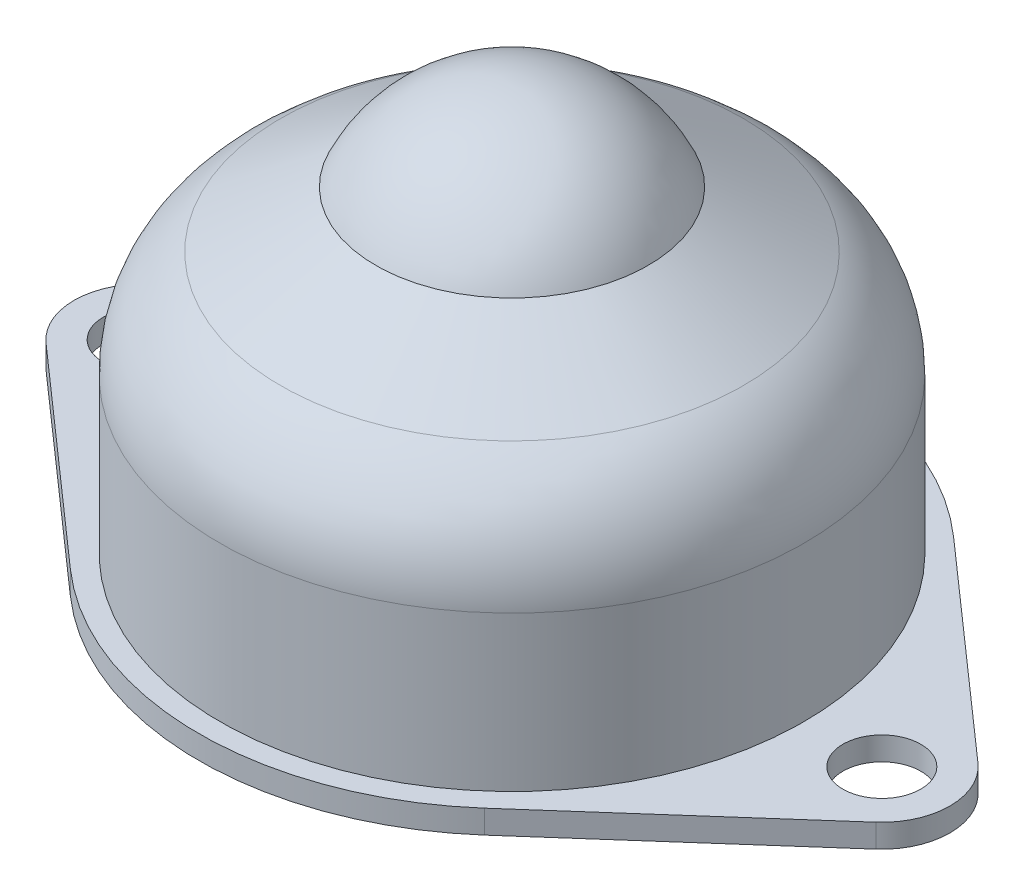
ISO-10303-21;
HEADER;
FILE_DESCRIPTION(('STEP AP214'),'2;1');
FILE_NAME('part.step','',(''),(''),'','','');
FILE_SCHEMA(('AUTOMOTIVE_DESIGN { 1 0 10303 214 1 1 1 1 }'));
ENDSEC;
DATA;
#1=APPLICATION_CONTEXT('core data for automotive mechanical design processes');
#2=APPLICATION_PROTOCOL_DEFINITION('international standard','automotive_design',2000,#1);
#3=PRODUCT_CONTEXT('',#1,'mechanical');
#4=PRODUCT('Part','Part','',(#3));
#5=PRODUCT_RELATED_PRODUCT_CATEGORY('part','',(#4));
#6=PRODUCT_DEFINITION_FORMATION('','',#4);
#7=PRODUCT_DEFINITION_CONTEXT('part definition',#1,'design');
#8=PRODUCT_DEFINITION('design','',#6,#7);
#9=PRODUCT_DEFINITION_SHAPE('','',#8);
#10=(LENGTH_UNIT() NAMED_UNIT(*) SI_UNIT(.MILLI.,.METRE.));
#11=(NAMED_UNIT(*) PLANE_ANGLE_UNIT() SI_UNIT($,.RADIAN.));
#12=(NAMED_UNIT(*) SI_UNIT($,.STERADIAN.) SOLID_ANGLE_UNIT());
#13=UNCERTAINTY_MEASURE_WITH_UNIT(LENGTH_MEASURE(1.E-05),#10,'distance_accuracy_value','');
#14=(GEOMETRIC_REPRESENTATION_CONTEXT(3) GLOBAL_UNCERTAINTY_ASSIGNED_CONTEXT((#13)) GLOBAL_UNIT_ASSIGNED_CONTEXT((#10,
#11,#12)) REPRESENTATION_CONTEXT('',''));
#15=CARTESIAN_POINT('',(0.,0.,0.));
#16=DIRECTION('',(0.,0.,1.));
#17=DIRECTION('',(1.,0.,0.));
#18=AXIS2_PLACEMENT_3D('',#15,#16,#17);
#19=CARTESIAN_POINT('',(0.,0.,0.));
#20=DIRECTION('',(0.,1.,0.));
#21=DIRECTION('',(0.,0.,1.));
#22=AXIS2_PLACEMENT_3D('',#19,#20,#21);
#23=PLANE('',#22);
#24=CARTESIAN_POINT('',(0.,0.,0.));
#25=DIRECTION('',(0.,1.,0.));
#26=DIRECTION('',(0.,0.,1.));
#27=AXIS2_PLACEMENT_3D('',#24,#25,#26);
#28=CIRCLE('',#27,16.075);
#29=CARTESIAN_POINT('',(-10.6391118421053,0.,12.0505155164074));
#30=VERTEX_POINT('',#29);
#31=CARTESIAN_POINT('',(10.6391118421053,0.,12.0505155164074));
#32=VERTEX_POINT('',#31);
#33=EDGE_CURVE('E204',#30,#32,#28,.T.);
#34=ORIENTED_EDGE('',*,*,#33,.F.);
#35=DIRECTION('',(0.74964326696158,0.,0.661842105263158));
#36=VECTOR('',#35,1.);
#37=CARTESIAN_POINT('',(-10.6391118421053,0.,12.0505155164074));
#38=LINE('',#37,#36);
#39=CARTESIAN_POINT('',(-21.3164473684211,0.,2.62375143436553));
#40=VERTEX_POINT('',#39);
#41=EDGE_CURVE('E201',#40,#30,#38,.T.);
#42=ORIENTED_EDGE('',*,*,#41,.F.);
#43=CARTESIAN_POINT('',(-19.,0.,0.));
#44=DIRECTION('',(0.,1.,0.));
#45=DIRECTION('',(0.,0.,1.));
#46=AXIS2_PLACEMENT_3D('',#43,#44,#45);
#47=CIRCLE('',#46,3.5);
#48=CARTESIAN_POINT('',(-21.3164473684211,0.,-2.62375143436553));
#49=VERTEX_POINT('',#48);
#50=EDGE_CURVE('E157',#49,#40,#47,.T.);
#51=ORIENTED_EDGE('',*,*,#50,.F.);
#52=DIRECTION('',(0.74964326696158,0.,-0.661842105263158));
#53=VECTOR('',#52,1.);
#54=CARTESIAN_POINT('',(-10.6391118421053,0.,-12.0505155164074));
#55=LINE('',#54,#53);
#56=CARTESIAN_POINT('',(-10.6391118421053,0.,-12.0505155164074));
#57=VERTEX_POINT('',#56);
#58=EDGE_CURVE('E195',#49,#57,#55,.T.);
#59=ORIENTED_EDGE('',*,*,#58,.T.);
#60=CARTESIAN_POINT('',(0.,0.,0.));
#61=DIRECTION('',(0.,1.,0.));
#62=DIRECTION('',(0.,0.,1.));
#63=AXIS2_PLACEMENT_3D('',#60,#61,#62);
#64=CIRCLE('',#63,16.075);
#65=CARTESIAN_POINT('',(10.6391118421053,0.,-12.0505155164074));
#66=VERTEX_POINT('',#65);
#67=EDGE_CURVE('E191',#66,#57,#64,.T.);
#68=ORIENTED_EDGE('',*,*,#67,.F.);
#69=DIRECTION('',(0.74964326696158,0.,0.661842105263158));
#70=VECTOR('',#69,1.);
#71=CARTESIAN_POINT('',(10.6391118421053,0.,-12.0505155164074));
#72=LINE('',#71,#70);
#73=CARTESIAN_POINT('',(21.3164473684211,0.,-2.62375143436553));
#74=VERTEX_POINT('',#73);
#75=EDGE_CURVE('E187',#66,#74,#72,.T.);
#76=ORIENTED_EDGE('',*,*,#75,.T.);
#77=CARTESIAN_POINT('',(19.,0.,0.));
#78=DIRECTION('',(0.,1.,0.));
#79=DIRECTION('',(0.,0.,1.));
#80=AXIS2_PLACEMENT_3D('',#77,#78,#79);
#81=CIRCLE('',#80,3.5);
#82=CARTESIAN_POINT('',(21.3164473684211,0.,2.62375143436552));
#83=VERTEX_POINT('',#82);
#84=EDGE_CURVE('E182',#83,#74,#81,.T.);
#85=ORIENTED_EDGE('',*,*,#84,.F.);
#86=DIRECTION('',(0.74964326696158,0.,-0.661842105263158));
#87=VECTOR('',#86,1.);
#88=CARTESIAN_POINT('',(10.6391118421053,0.,12.0505155164074));
#89=LINE('',#88,#87);
#90=EDGE_CURVE('E179',#32,#83,#89,.T.);
#91=ORIENTED_EDGE('',*,*,#90,.F.);
#92=EDGE_LOOP('',(#34,#42,#51,#59,#68,#76,#85,#91));
#93=FACE_BOUND('',#92,.T.);
#94=CARTESIAN_POINT('',(-19.,0.,0.));
#95=DIRECTION('',(0.,1.,0.));
#96=DIRECTION('',(0.,0.,1.));
#97=AXIS2_PLACEMENT_3D('',#94,#95,#96);
#98=CIRCLE('',#97,2.);
#99=CARTESIAN_POINT('',(-19.,0.,2.));
#100=VERTEX_POINT('',#99);
#101=EDGE_CURVE('E207',#100,#100,#98,.T.);
#102=ORIENTED_EDGE('',*,*,#101,.T.);
#103=EDGE_LOOP('',(#102));
#104=FACE_BOUND('',#103,.T.);
#105=CARTESIAN_POINT('',(19.,0.,0.));
#106=DIRECTION('',(0.,1.,0.));
#107=DIRECTION('',(0.,0.,1.));
#108=AXIS2_PLACEMENT_3D('',#105,#106,#107);
#109=CIRCLE('',#108,2.);
#110=CARTESIAN_POINT('',(19.,0.,1.99999999999999));
#111=VERTEX_POINT('',#110);
#112=EDGE_CURVE('E211',#111,#111,#109,.T.);
#113=ORIENTED_EDGE('',*,*,#112,.T.);
#114=EDGE_LOOP('',(#113));
#115=FACE_BOUND('',#114,.T.);
#116=ADVANCED_FACE('F68',(#93,#104,#115),#23,.F.);
#117=CARTESIAN_POINT('',(0.,1.2,0.));
#118=DIRECTION('',(0.,-1.,0.));
#119=DIRECTION('',(0.,0.,-1.));
#120=AXIS2_PLACEMENT_3D('',#117,#118,#119);
#121=CYLINDRICAL_SURFACE('',#120,16.075);
#122=ORIENTED_EDGE('',*,*,#33,.T.);
#123=DIRECTION('',(0.,-1.,0.));
#124=VECTOR('',#123,1.);
#125=CARTESIAN_POINT('',(10.6391118421053,1.2,12.0505155164074));
#126=LINE('',#125,#124);
#127=CARTESIAN_POINT('',(10.6391118421053,1.2,12.0505155164074));
#128=VERTEX_POINT('',#127);
#129=EDGE_CURVE('E86',#128,#32,#126,.T.);
#130=ORIENTED_EDGE('',*,*,#129,.F.);
#131=CARTESIAN_POINT('',(0.,1.2,0.));
#132=DIRECTION('',(0.,1.,0.));
#133=DIRECTION('',(0.,0.,1.));
#134=AXIS2_PLACEMENT_3D('',#131,#132,#133);
#135=CIRCLE('',#134,16.075);
#136=CARTESIAN_POINT('',(-10.6391118421053,1.2,12.0505155164074));
#137=VERTEX_POINT('',#136);
#138=EDGE_CURVE('E165',#137,#128,#135,.T.);
#139=ORIENTED_EDGE('',*,*,#138,.F.);
#140=DIRECTION('',(0.,-1.,0.));
#141=VECTOR('',#140,1.);
#142=CARTESIAN_POINT('',(-10.6391118421053,1.2,12.0505155164074));
#143=LINE('',#142,#141);
#144=EDGE_CURVE('E112',#137,#30,#143,.T.);
#145=ORIENTED_EDGE('',*,*,#144,.T.);
#146=EDGE_LOOP('',(#122,#130,#139,#145));
#147=FACE_BOUND('',#146,.T.);
#148=ADVANCED_FACE('F256',(#147),#121,.T.);
#149=CARTESIAN_POINT('',(0.,1.2,0.));
#150=DIRECTION('',(0.,-1.,0.));
#151=DIRECTION('',(0.,0.,-1.));
#152=AXIS2_PLACEMENT_3D('',#149,#150,#151);
#153=CYLINDRICAL_SURFACE('',#152,16.075);
#154=ORIENTED_EDGE('',*,*,#67,.T.);
#155=DIRECTION('',(0.,-1.,0.));
#156=VECTOR('',#155,1.);
#157=CARTESIAN_POINT('',(-10.6391118421053,1.2,-12.0505155164074));
#158=LINE('',#157,#156);
#159=CARTESIAN_POINT('',(-10.6391118421053,1.2,-12.0505155164074));
#160=VERTEX_POINT('',#159);
#161=EDGE_CURVE('E222',#160,#57,#158,.T.);
#162=ORIENTED_EDGE('',*,*,#161,.F.);
#163=CARTESIAN_POINT('',(0.,1.2,0.));
#164=DIRECTION('',(0.,1.,0.));
#165=DIRECTION('',(0.,0.,1.));
#166=AXIS2_PLACEMENT_3D('',#163,#164,#165);
#167=CIRCLE('',#166,16.075);
#168=CARTESIAN_POINT('',(10.6391118421053,1.2,-12.0505155164074));
#169=VERTEX_POINT('',#168);
#170=EDGE_CURVE('E245',#169,#160,#167,.T.);
#171=ORIENTED_EDGE('',*,*,#170,.F.);
#172=DIRECTION('',(0.,-1.,0.));
#173=VECTOR('',#172,1.);
#174=CARTESIAN_POINT('',(10.6391118421053,1.2,-12.0505155164074));
#175=LINE('',#174,#173);
#176=EDGE_CURVE('E225',#169,#66,#175,.T.);
#177=ORIENTED_EDGE('',*,*,#176,.T.);
#178=EDGE_LOOP('',(#154,#162,#171,#177));
#179=FACE_BOUND('',#178,.T.);
#180=ADVANCED_FACE('F243',(#179),#153,.T.);
#181=CARTESIAN_POINT('',(0.,1.2,0.));
#182=DIRECTION('',(0.,1.,0.));
#183=DIRECTION('',(0.,0.,1.));
#184=AXIS2_PLACEMENT_3D('',#181,#182,#183);
#185=PLANE('',#184);
#186=CARTESIAN_POINT('',(0.,1.2,0.));
#187=DIRECTION('',(0.,-1.,0.));
#188=DIRECTION('',(0.,0.,-1.));
#189=AXIS2_PLACEMENT_3D('',#186,#187,#188);
#190=CIRCLE('',#189,15.);
#191=CARTESIAN_POINT('',(0.,1.2,-15.));
#192=VERTEX_POINT('',#191);
#193=EDGE_CURVE('E183',#192,#192,#190,.T.);
#194=ORIENTED_EDGE('',*,*,#193,.T.);
#195=EDGE_LOOP('',(#194));
#196=FACE_BOUND('',#195,.T.);
#197=ORIENTED_EDGE('',*,*,#170,.T.);
#198=DIRECTION('',(0.74964326696158,0.,-0.661842105263158));
#199=VECTOR('',#198,1.);
#200=CARTESIAN_POINT('',(-10.6391118421053,1.2,-12.0505155164074));
#201=LINE('',#200,#199);
#202=CARTESIAN_POINT('',(-21.3164473684211,1.2,-2.62375143436553));
#203=VERTEX_POINT('',#202);
#204=EDGE_CURVE('E149',#203,#160,#201,.T.);
#205=ORIENTED_EDGE('',*,*,#204,.F.);
#206=CARTESIAN_POINT('',(-19.,1.2,0.));
#207=DIRECTION('',(0.,1.,0.));
#208=DIRECTION('',(0.,0.,1.));
#209=AXIS2_PLACEMENT_3D('',#206,#207,#208);
#210=CIRCLE('',#209,3.5);
#211=CARTESIAN_POINT('',(-21.3164473684211,1.2,2.62375143436553));
#212=VERTEX_POINT('',#211);
#213=EDGE_CURVE('E141',#203,#212,#210,.T.);
#214=ORIENTED_EDGE('',*,*,#213,.T.);
#215=DIRECTION('',(0.74964326696158,0.,0.661842105263158));
#216=VECTOR('',#215,1.);
#217=CARTESIAN_POINT('',(-10.6391118421053,1.2,12.0505155164074));
#218=LINE('',#217,#216);
#219=EDGE_CURVE('E147',#212,#137,#218,.T.);
#220=ORIENTED_EDGE('',*,*,#219,.T.);
#221=ORIENTED_EDGE('',*,*,#138,.T.);
#222=DIRECTION('',(0.74964326696158,0.,-0.661842105263158));
#223=VECTOR('',#222,1.);
#224=CARTESIAN_POINT('',(10.6391118421053,1.2,12.0505155164074));
#225=LINE('',#224,#223);
#226=CARTESIAN_POINT('',(21.3164473684211,1.2,2.62375143436552));
#227=VERTEX_POINT('',#226);
#228=EDGE_CURVE('E215',#128,#227,#225,.T.);
#229=ORIENTED_EDGE('',*,*,#228,.T.);
#230=CARTESIAN_POINT('',(19.,1.2,0.));
#231=DIRECTION('',(0.,1.,0.));
#232=DIRECTION('',(0.,0.,1.));
#233=AXIS2_PLACEMENT_3D('',#230,#231,#232);
#234=CIRCLE('',#233,3.5);
#235=CARTESIAN_POINT('',(21.3164473684211,1.2,-2.62375143436553));
#236=VERTEX_POINT('',#235);
#237=EDGE_CURVE('E124',#227,#236,#234,.T.);
#238=ORIENTED_EDGE('',*,*,#237,.T.);
#239=DIRECTION('',(0.74964326696158,0.,0.661842105263158));
#240=VECTOR('',#239,1.);
#241=CARTESIAN_POINT('',(10.6391118421053,1.2,-12.0505155164074));
#242=LINE('',#241,#240);
#243=EDGE_CURVE('E233',#169,#236,#242,.T.);
#244=ORIENTED_EDGE('',*,*,#243,.F.);
#245=EDGE_LOOP('',(#197,#205,#214,#220,#221,#229,#238,#244));
#246=FACE_BOUND('',#245,.T.);
#247=CARTESIAN_POINT('',(-19.,1.2,0.));
#248=DIRECTION('',(0.,1.,0.));
#249=DIRECTION('',(0.,0.,1.));
#250=AXIS2_PLACEMENT_3D('',#247,#248,#249);
#251=CIRCLE('',#250,2.);
#252=CARTESIAN_POINT('',(-19.,1.2,2.));
#253=VERTEX_POINT('',#252);
#254=EDGE_CURVE('E168',#253,#253,#251,.T.);
#255=ORIENTED_EDGE('',*,*,#254,.F.);
#256=EDGE_LOOP('',(#255));
#257=FACE_BOUND('',#256,.T.);
#258=CARTESIAN_POINT('',(19.,1.2,0.));
#259=DIRECTION('',(0.,1.,0.));
#260=DIRECTION('',(0.,0.,1.));
#261=AXIS2_PLACEMENT_3D('',#258,#259,#260);
#262=CIRCLE('',#261,2.);
#263=CARTESIAN_POINT('',(19.,1.2,1.99999999999999));
#264=VERTEX_POINT('',#263);
#265=EDGE_CURVE('E175',#264,#264,#262,.T.);
#266=ORIENTED_EDGE('',*,*,#265,.F.);
#267=EDGE_LOOP('',(#266));
#268=FACE_BOUND('',#267,.T.);
#269=ADVANCED_FACE('F144',(#196,#246,#257,#268),#185,.T.);
#270=CARTESIAN_POINT('',(10.6391118421053,1.2,12.0505155164074));
#271=DIRECTION('',(-0.661842105263158,0.,-0.74964326696158));
#272=DIRECTION('',(-0.74964326696158,0.,0.661842105263158));
#273=AXIS2_PLACEMENT_3D('',#270,#271,#272);
#274=PLANE('',#273);
#275=ORIENTED_EDGE('',*,*,#90,.T.);
#276=DIRECTION('',(0.,-1.,0.));
#277=VECTOR('',#276,1.);
#278=CARTESIAN_POINT('',(21.3164473684211,1.2,2.62375143436552));
#279=LINE('',#278,#277);
#280=EDGE_CURVE('E12',#227,#83,#279,.T.);
#281=ORIENTED_EDGE('',*,*,#280,.F.);
#282=ORIENTED_EDGE('',*,*,#228,.F.);
#283=ORIENTED_EDGE('',*,*,#129,.T.);
#284=EDGE_LOOP('',(#275,#281,#282,#283));
#285=FACE_BOUND('',#284,.T.);
#286=ADVANCED_FACE('F70',(#285),#274,.F.);
#287=CARTESIAN_POINT('',(19.,1.2,0.));
#288=DIRECTION('',(0.,-1.,0.));
#289=DIRECTION('',(0.,0.,-1.));
#290=AXIS2_PLACEMENT_3D('',#287,#288,#289);
#291=CYLINDRICAL_SURFACE('',#290,3.5);
#292=ORIENTED_EDGE('',*,*,#84,.T.);
#293=DIRECTION('',(0.,-1.,0.));
#294=VECTOR('',#293,1.);
#295=CARTESIAN_POINT('',(21.3164473684211,1.2,-2.62375143436553));
#296=LINE('',#295,#294);
#297=EDGE_CURVE('E78',#236,#74,#296,.T.);
#298=ORIENTED_EDGE('',*,*,#297,.F.);
#299=ORIENTED_EDGE('',*,*,#237,.F.);
#300=ORIENTED_EDGE('',*,*,#280,.T.);
#301=EDGE_LOOP('',(#292,#298,#299,#300));
#302=FACE_BOUND('',#301,.T.);
#303=ADVANCED_FACE('F234',(#302),#291,.T.);
#304=CARTESIAN_POINT('',(10.6391118421053,1.2,-12.0505155164074));
#305=DIRECTION('',(0.661842105263158,0.,-0.74964326696158));
#306=DIRECTION('',(-0.74964326696158,0.,-0.661842105263158));
#307=AXIS2_PLACEMENT_3D('',#304,#305,#306);
#308=PLANE('',#307);
#309=ORIENTED_EDGE('',*,*,#75,.F.);
#310=ORIENTED_EDGE('',*,*,#176,.F.);
#311=ORIENTED_EDGE('',*,*,#243,.T.);
#312=ORIENTED_EDGE('',*,*,#297,.T.);
#313=EDGE_LOOP('',(#309,#310,#311,#312));
#314=FACE_BOUND('',#313,.T.);
#315=ADVANCED_FACE('F231',(#314),#308,.T.);
#316=CARTESIAN_POINT('',(19.,1.2,0.));
#317=DIRECTION('',(0.,-1.,0.));
#318=DIRECTION('',(0.,0.,-1.));
#319=AXIS2_PLACEMENT_3D('',#316,#317,#318);
#320=CYLINDRICAL_SURFACE('',#319,2.);
#321=ORIENTED_EDGE('',*,*,#265,.T.);
#322=EDGE_LOOP('',(#321));
#323=FACE_BOUND('',#322,.T.);
#324=ORIENTED_EDGE('',*,*,#112,.F.);
#325=EDGE_LOOP('',(#324));
#326=FACE_BOUND('',#325,.T.);
#327=ADVANCED_FACE('F264',(#323,#326),#320,.F.);
#328=CARTESIAN_POINT('',(-10.6391118421053,1.2,-12.0505155164074));
#329=DIRECTION('',(-0.661842105263158,0.,-0.74964326696158));
#330=DIRECTION('',(-0.74964326696158,0.,0.661842105263158));
#331=AXIS2_PLACEMENT_3D('',#328,#329,#330);
#332=PLANE('',#331);
#333=ORIENTED_EDGE('',*,*,#58,.F.);
#334=DIRECTION('',(0.,-1.,0.));
#335=VECTOR('',#334,1.);
#336=CARTESIAN_POINT('',(-21.3164473684211,1.2,-2.62375143436553));
#337=LINE('',#336,#335);
#338=EDGE_CURVE('E161',#203,#49,#337,.T.);
#339=ORIENTED_EDGE('',*,*,#338,.F.);
#340=ORIENTED_EDGE('',*,*,#204,.T.);
#341=ORIENTED_EDGE('',*,*,#161,.T.);
#342=EDGE_LOOP('',(#333,#339,#340,#341));
#343=FACE_BOUND('',#342,.T.);
#344=ADVANCED_FACE('F255',(#343),#332,.T.);
#345=CARTESIAN_POINT('',(-19.,1.2,0.));
#346=DIRECTION('',(0.,-1.,0.));
#347=DIRECTION('',(0.,0.,-1.));
#348=AXIS2_PLACEMENT_3D('',#345,#346,#347);
#349=CYLINDRICAL_SURFACE('',#348,3.5);
#350=ORIENTED_EDGE('',*,*,#50,.T.);
#351=DIRECTION('',(0.,-1.,0.));
#352=VECTOR('',#351,1.);
#353=CARTESIAN_POINT('',(-21.3164473684211,1.2,2.62375143436553));
#354=LINE('',#353,#352);
#355=EDGE_CURVE('E154',#212,#40,#354,.T.);
#356=ORIENTED_EDGE('',*,*,#355,.F.);
#357=ORIENTED_EDGE('',*,*,#213,.F.);
#358=ORIENTED_EDGE('',*,*,#338,.T.);
#359=EDGE_LOOP('',(#350,#356,#357,#358));
#360=FACE_BOUND('',#359,.T.);
#361=ADVANCED_FACE('F155',(#360),#349,.T.);
#362=CARTESIAN_POINT('',(-10.6391118421053,1.2,12.0505155164074));
#363=DIRECTION('',(0.661842105263158,0.,-0.74964326696158));
#364=DIRECTION('',(-0.74964326696158,0.,-0.661842105263158));
#365=AXIS2_PLACEMENT_3D('',#362,#363,#364);
#366=PLANE('',#365);
#367=ORIENTED_EDGE('',*,*,#41,.T.);
#368=ORIENTED_EDGE('',*,*,#144,.F.);
#369=ORIENTED_EDGE('',*,*,#219,.F.);
#370=ORIENTED_EDGE('',*,*,#355,.T.);
#371=EDGE_LOOP('',(#367,#368,#369,#370));
#372=FACE_BOUND('',#371,.T.);
#373=ADVANCED_FACE('F163',(#372),#366,.F.);
#374=CARTESIAN_POINT('',(-19.,1.2,0.));
#375=DIRECTION('',(0.,-1.,0.));
#376=DIRECTION('',(0.,0.,-1.));
#377=AXIS2_PLACEMENT_3D('',#374,#375,#376);
#378=CYLINDRICAL_SURFACE('',#377,2.);
#379=ORIENTED_EDGE('',*,*,#254,.T.);
#380=EDGE_LOOP('',(#379));
#381=FACE_BOUND('',#380,.T.);
#382=ORIENTED_EDGE('',*,*,#101,.F.);
#383=EDGE_LOOP('',(#382));
#384=FACE_BOUND('',#383,.T.);
#385=ADVANCED_FACE('F268',(#381,#384),#378,.F.);
#386=CARTESIAN_POINT('',(0.,1.2,0.));
#387=DIRECTION('',(0.,-1.,0.));
#388=DIRECTION('',(0.,0.,-1.));
#389=AXIS2_PLACEMENT_3D('',#386,#387,#388);
#390=CYLINDRICAL_SURFACE('',#389,15.);
#391=ORIENTED_EDGE('',*,*,#193,.F.);
#392=EDGE_LOOP('',(#391));
#393=FACE_BOUND('',#392,.T.);
#394=CARTESIAN_POINT('',(0.,9.1375,0.));
#395=DIRECTION('',(0.,-1.,0.));
#396=DIRECTION('',(0.,0.,-1.));
#397=AXIS2_PLACEMENT_3D('',#394,#395,#396);
#398=CIRCLE('',#397,15.);
#399=CARTESIAN_POINT('',(0.,9.1375,-15.));
#400=VERTEX_POINT('',#399);
#401=EDGE_CURVE('E292',#400,#400,#398,.T.);
#402=ORIENTED_EDGE('',*,*,#401,.T.);
#403=EDGE_LOOP('',(#402));
#404=FACE_BOUND('',#403,.T.);
#405=ADVANCED_FACE('F286',(#393,#404),#390,.T.);
#406=CARTESIAN_POINT('',(0.,9.1375,0.));
#407=DIRECTION('',(0.,-1.,0.));
#408=DIRECTION('',(0.,0.,-1.));
#409=AXIS2_PLACEMENT_3D('',#406,#407,#408);
#410=TOROIDAL_SURFACE('',#409,8.65,6.35);
#411=ORIENTED_EDGE('',*,*,#401,.F.);
#412=EDGE_LOOP('',(#411));
#413=FACE_BOUND('',#412,.T.);
#414=CARTESIAN_POINT('',(0.,14.5986340014852,0.));
#415=DIRECTION('',(0.,-1.,0.));
#416=DIRECTION('',(0.,0.,-1.));
#417=AXIS2_PLACEMENT_3D('',#414,#415,#416);
#418=CIRCLE('',#417,11.8901412651029);
#419=CARTESIAN_POINT('',(0.,14.5986340014852,-11.8901412651029));
#420=VERTEX_POINT('',#419);
#421=EDGE_CURVE('E296',#420,#420,#418,.T.);
#422=ORIENTED_EDGE('',*,*,#421,.T.);
#423=EDGE_LOOP('',(#422));
#424=FACE_BOUND('',#423,.T.);
#425=ADVANCED_FACE('F313',(#413,#424),#410,.T.);
#426=CARTESIAN_POINT('',(0.,17.5,0.));
#427=DIRECTION('',(0.,-1.,0.));
#428=DIRECTION('',(0.,0.,-1.));
#429=AXIS2_PLACEMENT_3D('',#426,#427,#428);
#430=CONICAL_SURFACE('',#429,7.,1.03531102771915);
#431=ORIENTED_EDGE('',*,*,#421,.F.);
#432=EDGE_LOOP('',(#431));
#433=FACE_BOUND('',#432,.T.);
#434=CARTESIAN_POINT('',(0.,17.5,0.));
#435=DIRECTION('',(0.,-1.,0.));
#436=DIRECTION('',(0.,0.,-1.));
#437=AXIS2_PLACEMENT_3D('',#434,#435,#436);
#438=CIRCLE('',#437,7.);
#439=CARTESIAN_POINT('',(0.,17.5,-7.));
#440=VERTEX_POINT('',#439);
#441=EDGE_CURVE('E300',#440,#440,#438,.T.);
#442=ORIENTED_EDGE('',*,*,#441,.T.);
#443=EDGE_LOOP('',(#442));
#444=FACE_BOUND('',#443,.T.);
#445=ADVANCED_FACE('F305',(#433,#444),#430,.T.);
#446=CARTESIAN_POINT('',(0.,14.3055555555556,0.));
#447=DIRECTION('',(0.,-1.,0.));
#448=DIRECTION('',(-1.,0.,0.));
#449=AXIS2_PLACEMENT_3D('',#446,#447,#448);
#450=SPHERICAL_SURFACE('',#449,7.69444444444445);
#451=ORIENTED_EDGE('',*,*,#441,.F.);
#452=EDGE_LOOP('',(#451));
#453=FACE_BOUND('',#452,.T.);
#454=ADVANCED_FACE('F307',(#453),#450,.T.);
#455=CLOSED_SHELL('',(#116,#148,#180,#269,#286,#303,#315,#327,#344,#361,#373,#385,#405,#425,
#445,#454));
#456=MANIFOLD_SOLID_BREP('B2',#455);
#457=ADVANCED_BREP_SHAPE_REPRESENTATION('',(#18,#456),#14);
#458=SHAPE_DEFINITION_REPRESENTATION(#9,#457);
ENDSEC;
END-ISO-10303-21;
